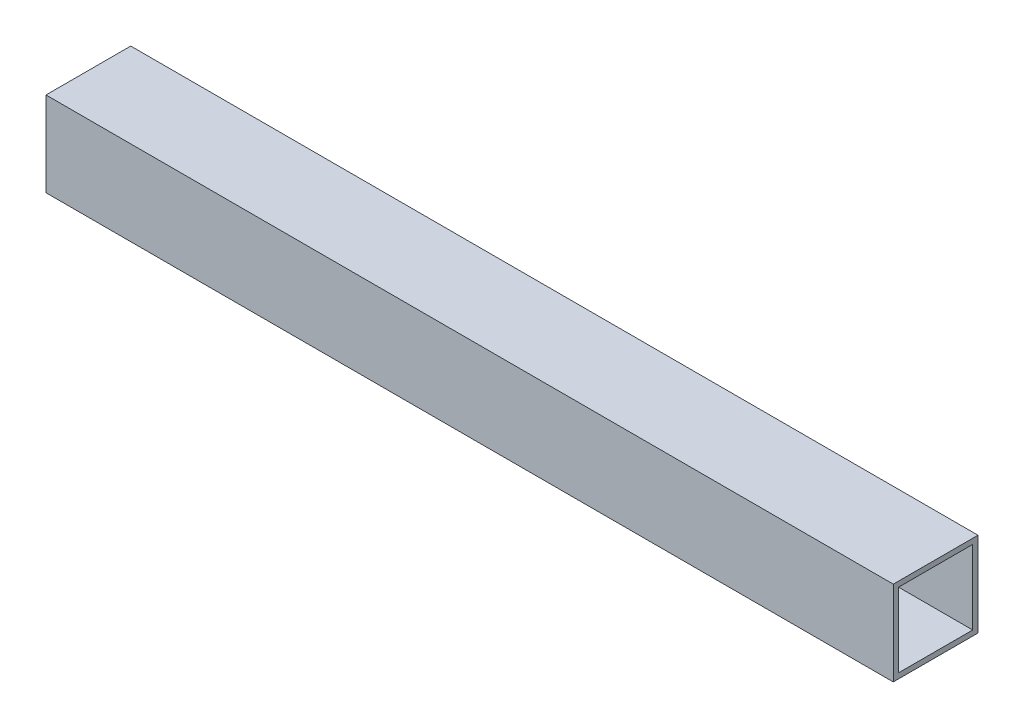
ISO-10303-21;
HEADER;
FILE_DESCRIPTION(('STEP AP214'),'2;1');
FILE_NAME('part.step','',(''),(''),'','','');
FILE_SCHEMA(('AUTOMOTIVE_DESIGN { 1 0 10303 214 1 1 1 1 }'));
ENDSEC;
DATA;
#1=APPLICATION_CONTEXT('core data for automotive mechanical design processes');
#2=APPLICATION_PROTOCOL_DEFINITION('international standard','automotive_design',2000,#1);
#3=PRODUCT_CONTEXT('',#1,'mechanical');
#4=PRODUCT('Part','Part','',(#3));
#5=PRODUCT_RELATED_PRODUCT_CATEGORY('part','',(#4));
#6=PRODUCT_DEFINITION_FORMATION('','',#4);
#7=PRODUCT_DEFINITION_CONTEXT('part definition',#1,'design');
#8=PRODUCT_DEFINITION('design','',#6,#7);
#9=PRODUCT_DEFINITION_SHAPE('','',#8);
#10=(LENGTH_UNIT() NAMED_UNIT(*) SI_UNIT(.MILLI.,.METRE.));
#11=(NAMED_UNIT(*) PLANE_ANGLE_UNIT() SI_UNIT($,.RADIAN.));
#12=(NAMED_UNIT(*) SI_UNIT($,.STERADIAN.) SOLID_ANGLE_UNIT());
#13=UNCERTAINTY_MEASURE_WITH_UNIT(LENGTH_MEASURE(1.E-05),#10,'distance_accuracy_value','');
#14=(GEOMETRIC_REPRESENTATION_CONTEXT(3) GLOBAL_UNCERTAINTY_ASSIGNED_CONTEXT((#13)) GLOBAL_UNIT_ASSIGNED_CONTEXT((#10,
#11,#12)) REPRESENTATION_CONTEXT('',''));
#15=CARTESIAN_POINT('',(0.,0.,0.));
#16=DIRECTION('',(0.,0.,1.));
#17=DIRECTION('',(1.,0.,0.));
#18=AXIS2_PLACEMENT_3D('',#15,#16,#17);
#19=CARTESIAN_POINT('',(254.,0.,0.));
#20=DIRECTION('',(1.,0.,0.));
#21=DIRECTION('',(0.,0.,-1.));
#22=AXIS2_PLACEMENT_3D('',#19,#20,#21);
#23=PLANE('',#22);
#24=DIRECTION('',(0.,1.,0.));
#25=VECTOR('',#24,1.);
#26=CARTESIAN_POINT('',(254.,-12.7,-12.7));
#27=LINE('',#26,#25);
#28=CARTESIAN_POINT('',(254.,-12.7,-12.7));
#29=VERTEX_POINT('',#28);
#30=CARTESIAN_POINT('',(254.,12.7,-12.7));
#31=VERTEX_POINT('',#30);
#32=EDGE_CURVE('E168',#29,#31,#27,.T.);
#33=ORIENTED_EDGE('',*,*,#32,.T.);
#34=DIRECTION('',(0.,0.,1.));
#35=VECTOR('',#34,1.);
#36=CARTESIAN_POINT('',(254.,12.7,12.7));
#37=LINE('',#36,#35);
#38=CARTESIAN_POINT('',(254.,12.7,12.7));
#39=VERTEX_POINT('',#38);
#40=EDGE_CURVE('E171',#31,#39,#37,.T.);
#41=ORIENTED_EDGE('',*,*,#40,.T.);
#42=DIRECTION('',(0.,-1.,0.));
#43=VECTOR('',#42,1.);
#44=CARTESIAN_POINT('',(254.,-12.7,12.7));
#45=LINE('',#44,#43);
#46=CARTESIAN_POINT('',(254.,-12.7,12.7));
#47=VERTEX_POINT('',#46);
#48=EDGE_CURVE('E174',#39,#47,#45,.T.);
#49=ORIENTED_EDGE('',*,*,#48,.T.);
#50=DIRECTION('',(0.,0.,-1.));
#51=VECTOR('',#50,1.);
#52=CARTESIAN_POINT('',(254.,-12.7,12.7));
#53=LINE('',#52,#51);
#54=EDGE_CURVE('E176',#47,#29,#53,.T.);
#55=ORIENTED_EDGE('',*,*,#54,.T.);
#56=EDGE_LOOP('',(#33,#41,#49,#55));
#57=FACE_BOUND('',#56,.T.);
#58=DIRECTION('',(0.,0.,1.));
#59=VECTOR('',#58,1.);
#60=CARTESIAN_POINT('',(254.,11.1125,0.));
#61=LINE('',#60,#59);
#62=CARTESIAN_POINT('',(254.,11.1125,-11.1125));
#63=VERTEX_POINT('',#62);
#64=CARTESIAN_POINT('',(254.,11.1125,11.1125));
#65=VERTEX_POINT('',#64);
#66=EDGE_CURVE('E140',#63,#65,#61,.T.);
#67=ORIENTED_EDGE('',*,*,#66,.F.);
#68=DIRECTION('',(0.,1.,0.));
#69=VECTOR('',#68,1.);
#70=CARTESIAN_POINT('',(254.,0.,-11.1125));
#71=LINE('',#70,#69);
#72=CARTESIAN_POINT('',(254.,-11.1125,-11.1125));
#73=VERTEX_POINT('',#72);
#74=EDGE_CURVE('E132',#73,#63,#71,.T.);
#75=ORIENTED_EDGE('',*,*,#74,.F.);
#76=DIRECTION('',(0.,0.,-1.));
#77=VECTOR('',#76,1.);
#78=CARTESIAN_POINT('',(254.,-11.1125,0.));
#79=LINE('',#78,#77);
#80=CARTESIAN_POINT('',(254.,-11.1125,11.1125));
#81=VERTEX_POINT('',#80);
#82=EDGE_CURVE('E154',#81,#73,#79,.T.);
#83=ORIENTED_EDGE('',*,*,#82,.F.);
#84=DIRECTION('',(0.,-1.,0.));
#85=VECTOR('',#84,1.);
#86=CARTESIAN_POINT('',(254.,0.,11.1125));
#87=LINE('',#86,#85);
#88=EDGE_CURVE('E152',#65,#81,#87,.T.);
#89=ORIENTED_EDGE('',*,*,#88,.F.);
#90=EDGE_LOOP('',(#67,#75,#83,#89));
#91=FACE_BOUND('',#90,.T.);
#92=ADVANCED_FACE('F67',(#57,#91),#23,.T.);
#93=CARTESIAN_POINT('',(0.,0.,0.));
#94=DIRECTION('',(1.,0.,0.));
#95=DIRECTION('',(0.,0.,-1.));
#96=AXIS2_PLACEMENT_3D('',#93,#94,#95);
#97=PLANE('',#96);
#98=DIRECTION('',(0.,1.,0.));
#99=VECTOR('',#98,1.);
#100=CARTESIAN_POINT('',(0.,-12.7,-12.7));
#101=LINE('',#100,#99);
#102=CARTESIAN_POINT('',(0.,-12.7,-12.7));
#103=VERTEX_POINT('',#102);
#104=CARTESIAN_POINT('',(0.,12.7,-12.7));
#105=VERTEX_POINT('',#104);
#106=EDGE_CURVE('E148',#103,#105,#101,.T.);
#107=ORIENTED_EDGE('',*,*,#106,.F.);
#108=DIRECTION('',(0.,0.,-1.));
#109=VECTOR('',#108,1.);
#110=CARTESIAN_POINT('',(0.,-12.7,12.7));
#111=LINE('',#110,#109);
#112=CARTESIAN_POINT('',(0.,-12.7,12.7));
#113=VERTEX_POINT('',#112);
#114=EDGE_CURVE('E172',#113,#103,#111,.T.);
#115=ORIENTED_EDGE('',*,*,#114,.F.);
#116=DIRECTION('',(0.,-1.,0.));
#117=VECTOR('',#116,1.);
#118=CARTESIAN_POINT('',(0.,-12.7,12.7));
#119=LINE('',#118,#117);
#120=CARTESIAN_POINT('',(0.,12.7,12.7));
#121=VERTEX_POINT('',#120);
#122=EDGE_CURVE('E183',#121,#113,#119,.T.);
#123=ORIENTED_EDGE('',*,*,#122,.F.);
#124=DIRECTION('',(0.,0.,1.));
#125=VECTOR('',#124,1.);
#126=CARTESIAN_POINT('',(0.,12.7,12.7));
#127=LINE('',#126,#125);
#128=EDGE_CURVE('E181',#105,#121,#127,.T.);
#129=ORIENTED_EDGE('',*,*,#128,.F.);
#130=EDGE_LOOP('',(#107,#115,#123,#129));
#131=FACE_BOUND('',#130,.T.);
#132=DIRECTION('',(0.,1.,0.));
#133=VECTOR('',#132,1.);
#134=CARTESIAN_POINT('',(0.,0.,-11.1125));
#135=LINE('',#134,#133);
#136=CARTESIAN_POINT('',(0.,-11.1125,-11.1125));
#137=VERTEX_POINT('',#136);
#138=CARTESIAN_POINT('',(0.,11.1125,-11.1125));
#139=VERTEX_POINT('',#138);
#140=EDGE_CURVE('E90',#137,#139,#135,.T.);
#141=ORIENTED_EDGE('',*,*,#140,.T.);
#142=DIRECTION('',(0.,0.,1.));
#143=VECTOR('',#142,1.);
#144=CARTESIAN_POINT('',(0.,11.1125,0.));
#145=LINE('',#144,#143);
#146=CARTESIAN_POINT('',(0.,11.1125,11.1125));
#147=VERTEX_POINT('',#146);
#148=EDGE_CURVE('E147',#139,#147,#145,.T.);
#149=ORIENTED_EDGE('',*,*,#148,.T.);
#150=DIRECTION('',(0.,-1.,0.));
#151=VECTOR('',#150,1.);
#152=CARTESIAN_POINT('',(0.,0.,11.1125));
#153=LINE('',#152,#151);
#154=CARTESIAN_POINT('',(0.,-11.1125,11.1125));
#155=VERTEX_POINT('',#154);
#156=EDGE_CURVE('E160',#147,#155,#153,.T.);
#157=ORIENTED_EDGE('',*,*,#156,.T.);
#158=DIRECTION('',(0.,0.,-1.));
#159=VECTOR('',#158,1.);
#160=CARTESIAN_POINT('',(0.,-11.1125,0.));
#161=LINE('',#160,#159);
#162=EDGE_CURVE('E141',#155,#137,#161,.T.);
#163=ORIENTED_EDGE('',*,*,#162,.T.);
#164=EDGE_LOOP('',(#141,#149,#157,#163));
#165=FACE_BOUND('',#164,.T.);
#166=ADVANCED_FACE('F201',(#131,#165),#97,.F.);
#167=CARTESIAN_POINT('',(254.,-12.7,-12.7));
#168=DIRECTION('',(0.,0.,1.));
#169=DIRECTION('',(1.,0.,0.));
#170=AXIS2_PLACEMENT_3D('',#167,#168,#169);
#171=PLANE('',#170);
#172=ORIENTED_EDGE('',*,*,#106,.T.);
#173=DIRECTION('',(-1.,0.,0.));
#174=VECTOR('',#173,1.);
#175=CARTESIAN_POINT('',(254.,12.7,-12.7));
#176=LINE('',#175,#174);
#177=EDGE_CURVE('E12',#31,#105,#176,.T.);
#178=ORIENTED_EDGE('',*,*,#177,.F.);
#179=ORIENTED_EDGE('',*,*,#32,.F.);
#180=DIRECTION('',(-1.,0.,0.));
#181=VECTOR('',#180,1.);
#182=CARTESIAN_POINT('',(254.,-12.7,-12.7));
#183=LINE('',#182,#181);
#184=EDGE_CURVE('E178',#29,#103,#183,.T.);
#185=ORIENTED_EDGE('',*,*,#184,.T.);
#186=EDGE_LOOP('',(#172,#178,#179,#185));
#187=FACE_BOUND('',#186,.T.);
#188=ADVANCED_FACE('F69',(#187),#171,.F.);
#189=CARTESIAN_POINT('',(254.,12.7,12.7));
#190=DIRECTION('',(0.,-1.,0.));
#191=DIRECTION('',(0.,0.,-1.));
#192=AXIS2_PLACEMENT_3D('',#189,#190,#191);
#193=PLANE('',#192);
#194=ORIENTED_EDGE('',*,*,#128,.T.);
#195=DIRECTION('',(-1.,0.,0.));
#196=VECTOR('',#195,1.);
#197=CARTESIAN_POINT('',(254.,12.7,12.7));
#198=LINE('',#197,#196);
#199=EDGE_CURVE('E75',#39,#121,#198,.T.);
#200=ORIENTED_EDGE('',*,*,#199,.F.);
#201=ORIENTED_EDGE('',*,*,#40,.F.);
#202=ORIENTED_EDGE('',*,*,#177,.T.);
#203=EDGE_LOOP('',(#194,#200,#201,#202));
#204=FACE_BOUND('',#203,.T.);
#205=ADVANCED_FACE('F211',(#204),#193,.F.);
#206=CARTESIAN_POINT('',(254.,-12.7,12.7));
#207=DIRECTION('',(0.,0.,-1.));
#208=DIRECTION('',(-1.,0.,0.));
#209=AXIS2_PLACEMENT_3D('',#206,#207,#208);
#210=PLANE('',#209);
#211=ORIENTED_EDGE('',*,*,#122,.T.);
#212=DIRECTION('',(-1.,0.,0.));
#213=VECTOR('',#212,1.);
#214=CARTESIAN_POINT('',(254.,-12.7,12.7));
#215=LINE('',#214,#213);
#216=EDGE_CURVE('E188',#47,#113,#215,.T.);
#217=ORIENTED_EDGE('',*,*,#216,.F.);
#218=ORIENTED_EDGE('',*,*,#48,.F.);
#219=ORIENTED_EDGE('',*,*,#199,.T.);
#220=EDGE_LOOP('',(#211,#217,#218,#219));
#221=FACE_BOUND('',#220,.T.);
#222=ADVANCED_FACE('F195',(#221),#210,.F.);
#223=CARTESIAN_POINT('',(254.,-12.7,12.7));
#224=DIRECTION('',(0.,1.,0.));
#225=DIRECTION('',(0.,0.,1.));
#226=AXIS2_PLACEMENT_3D('',#223,#224,#225);
#227=PLANE('',#226);
#228=ORIENTED_EDGE('',*,*,#114,.T.);
#229=ORIENTED_EDGE('',*,*,#184,.F.);
#230=ORIENTED_EDGE('',*,*,#54,.F.);
#231=ORIENTED_EDGE('',*,*,#216,.T.);
#232=EDGE_LOOP('',(#228,#229,#230,#231));
#233=FACE_BOUND('',#232,.T.);
#234=ADVANCED_FACE('F205',(#233),#227,.F.);
#235=CARTESIAN_POINT('',(254.,0.,-11.1125));
#236=DIRECTION('',(0.,0.,1.));
#237=DIRECTION('',(1.,0.,0.));
#238=AXIS2_PLACEMENT_3D('',#235,#236,#237);
#239=PLANE('',#238);
#240=ORIENTED_EDGE('',*,*,#140,.F.);
#241=DIRECTION('',(-1.,0.,0.));
#242=VECTOR('',#241,1.);
#243=CARTESIAN_POINT('',(254.,-11.1125,-11.1125));
#244=LINE('',#243,#242);
#245=EDGE_CURVE('E136',#73,#137,#244,.T.);
#246=ORIENTED_EDGE('',*,*,#245,.F.);
#247=ORIENTED_EDGE('',*,*,#74,.T.);
#248=DIRECTION('',(-1.,0.,0.));
#249=VECTOR('',#248,1.);
#250=CARTESIAN_POINT('',(254.,11.1125,-11.1125));
#251=LINE('',#250,#249);
#252=EDGE_CURVE('E135',#63,#139,#251,.T.);
#253=ORIENTED_EDGE('',*,*,#252,.T.);
#254=EDGE_LOOP('',(#240,#246,#247,#253));
#255=FACE_BOUND('',#254,.T.);
#256=ADVANCED_FACE('F134',(#255),#239,.T.);
#257=CARTESIAN_POINT('',(254.,11.1125,0.));
#258=DIRECTION('',(0.,-1.,0.));
#259=DIRECTION('',(0.,0.,-1.));
#260=AXIS2_PLACEMENT_3D('',#257,#258,#259);
#261=PLANE('',#260);
#262=ORIENTED_EDGE('',*,*,#148,.F.);
#263=ORIENTED_EDGE('',*,*,#252,.F.);
#264=ORIENTED_EDGE('',*,*,#66,.T.);
#265=DIRECTION('',(-1.,0.,0.));
#266=VECTOR('',#265,1.);
#267=CARTESIAN_POINT('',(254.,11.1125,11.1125));
#268=LINE('',#267,#266);
#269=EDGE_CURVE('E149',#65,#147,#268,.T.);
#270=ORIENTED_EDGE('',*,*,#269,.T.);
#271=EDGE_LOOP('',(#262,#263,#264,#270));
#272=FACE_BOUND('',#271,.T.);
#273=ADVANCED_FACE('F144',(#272),#261,.T.);
#274=CARTESIAN_POINT('',(254.,0.,11.1125));
#275=DIRECTION('',(0.,0.,-1.));
#276=DIRECTION('',(-1.,0.,0.));
#277=AXIS2_PLACEMENT_3D('',#274,#275,#276);
#278=PLANE('',#277);
#279=ORIENTED_EDGE('',*,*,#156,.F.);
#280=ORIENTED_EDGE('',*,*,#269,.F.);
#281=ORIENTED_EDGE('',*,*,#88,.T.);
#282=DIRECTION('',(-1.,0.,0.));
#283=VECTOR('',#282,1.);
#284=CARTESIAN_POINT('',(254.,-11.1125,11.1125));
#285=LINE('',#284,#283);
#286=EDGE_CURVE('E82',#81,#155,#285,.T.);
#287=ORIENTED_EDGE('',*,*,#286,.T.);
#288=EDGE_LOOP('',(#279,#280,#281,#287));
#289=FACE_BOUND('',#288,.T.);
#290=ADVANCED_FACE('F234',(#289),#278,.T.);
#291=CARTESIAN_POINT('',(254.,-11.1125,0.));
#292=DIRECTION('',(0.,1.,0.));
#293=DIRECTION('',(0.,0.,1.));
#294=AXIS2_PLACEMENT_3D('',#291,#292,#293);
#295=PLANE('',#294);
#296=ORIENTED_EDGE('',*,*,#162,.F.);
#297=ORIENTED_EDGE('',*,*,#286,.F.);
#298=ORIENTED_EDGE('',*,*,#82,.T.);
#299=ORIENTED_EDGE('',*,*,#245,.T.);
#300=EDGE_LOOP('',(#296,#297,#298,#299));
#301=FACE_BOUND('',#300,.T.);
#302=ADVANCED_FACE('F238',(#301),#295,.T.);
#303=CLOSED_SHELL('',(#92,#166,#188,#205,#222,#234,#256,#273,#290,#302));
#304=MANIFOLD_SOLID_BREP('B2',#303);
#305=ADVANCED_BREP_SHAPE_REPRESENTATION('',(#18,#304),#14);
#306=SHAPE_DEFINITION_REPRESENTATION(#9,#305);
ENDSEC;
END-ISO-10303-21;
